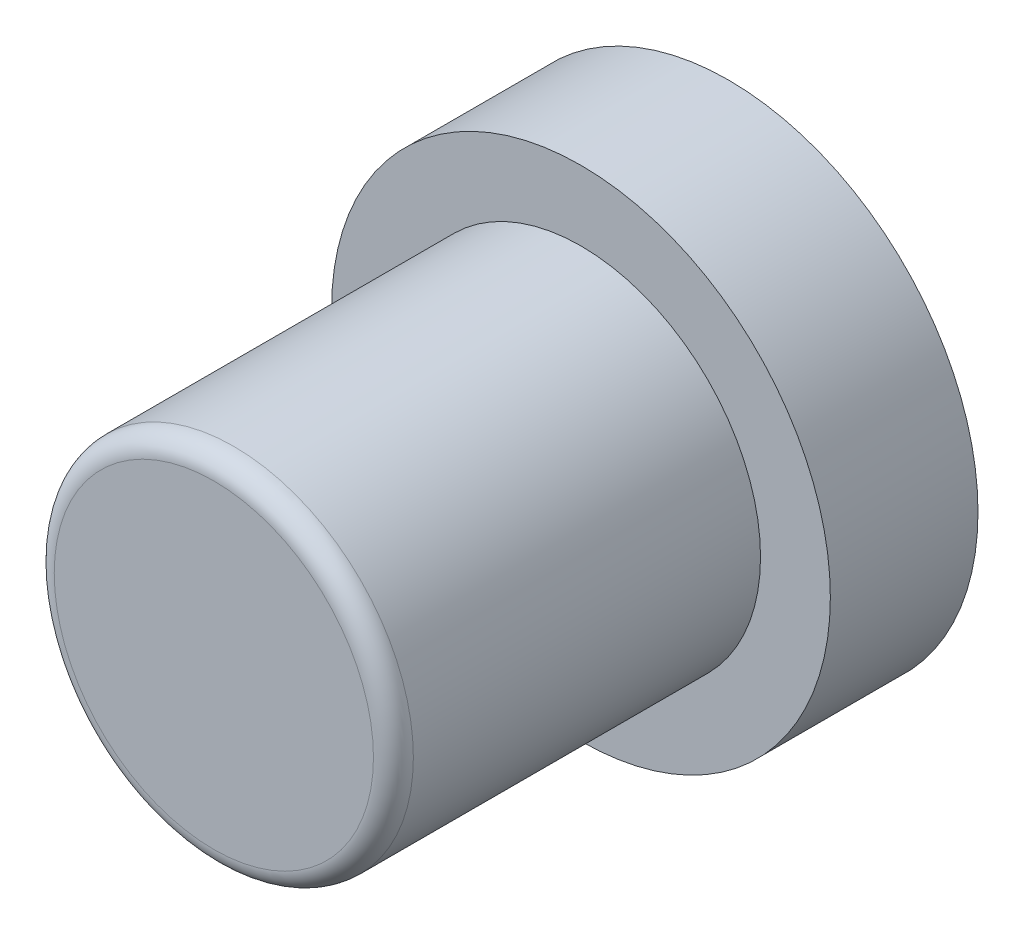
ISO-10303-21;
HEADER;
FILE_DESCRIPTION(('STEP AP214'),'2;1');
FILE_NAME('part.step','',(''),(''),'','','');
FILE_SCHEMA(('AUTOMOTIVE_DESIGN { 1 0 10303 214 1 1 1 1 }'));
ENDSEC;
DATA;
#1=APPLICATION_CONTEXT('core data for automotive mechanical design processes');
#2=APPLICATION_PROTOCOL_DEFINITION('international standard','automotive_design',2000,#1);
#3=PRODUCT_CONTEXT('',#1,'mechanical');
#4=PRODUCT('Part','Part','',(#3));
#5=PRODUCT_RELATED_PRODUCT_CATEGORY('part','',(#4));
#6=PRODUCT_DEFINITION_FORMATION('','',#4);
#7=PRODUCT_DEFINITION_CONTEXT('part definition',#1,'design');
#8=PRODUCT_DEFINITION('design','',#6,#7);
#9=PRODUCT_DEFINITION_SHAPE('','',#8);
#10=(LENGTH_UNIT() NAMED_UNIT(*) SI_UNIT(.MILLI.,.METRE.));
#11=(NAMED_UNIT(*) PLANE_ANGLE_UNIT() SI_UNIT($,.RADIAN.));
#12=(NAMED_UNIT(*) SI_UNIT($,.STERADIAN.) SOLID_ANGLE_UNIT());
#13=UNCERTAINTY_MEASURE_WITH_UNIT(LENGTH_MEASURE(1.E-05),#10,'distance_accuracy_value','');
#14=(GEOMETRIC_REPRESENTATION_CONTEXT(3) GLOBAL_UNCERTAINTY_ASSIGNED_CONTEXT((#13)) GLOBAL_UNIT_ASSIGNED_CONTEXT((#10,
#11,#12)) REPRESENTATION_CONTEXT('',''));
#15=CARTESIAN_POINT('',(0.,0.,0.));
#16=DIRECTION('',(0.,0.,1.));
#17=DIRECTION('',(1.,0.,0.));
#18=AXIS2_PLACEMENT_3D('',#15,#16,#17);
#19=CARTESIAN_POINT('',(0.,0.,3.7));
#20=DIRECTION('',(0.,0.,-1.));
#21=DIRECTION('',(-1.,0.,0.));
#22=AXIS2_PLACEMENT_3D('',#19,#20,#21);
#23=CYLINDRICAL_SURFACE('',#22,6.25);
#24=CARTESIAN_POINT('',(0.,0.,3.7));
#25=DIRECTION('',(0.,0.,1.));
#26=DIRECTION('',(1.,0.,0.));
#27=AXIS2_PLACEMENT_3D('',#24,#25,#26);
#28=CIRCLE('',#27,6.25);
#29=CARTESIAN_POINT('',(6.25,0.,3.7));
#30=VERTEX_POINT('',#29);
#31=EDGE_CURVE('E45',#30,#30,#28,.T.);
#32=ORIENTED_EDGE('',*,*,#31,.F.);
#33=EDGE_LOOP('',(#32));
#34=FACE_BOUND('',#33,.T.);
#35=CARTESIAN_POINT('',(0.,0.,0.));
#36=DIRECTION('',(0.,0.,1.));
#37=DIRECTION('',(1.,0.,0.));
#38=AXIS2_PLACEMENT_3D('',#35,#36,#37);
#39=CIRCLE('',#38,6.25);
#40=CARTESIAN_POINT('',(6.25,0.,0.));
#41=VERTEX_POINT('',#40);
#42=EDGE_CURVE('E48',#41,#41,#39,.T.);
#43=ORIENTED_EDGE('',*,*,#42,.T.);
#44=EDGE_LOOP('',(#43));
#45=FACE_BOUND('',#44,.T.);
#46=ADVANCED_FACE('F30',(#34,#45),#23,.T.);
#47=CARTESIAN_POINT('',(0.,0.,3.7));
#48=DIRECTION('',(0.,0.,1.));
#49=DIRECTION('',(1.,0.,0.));
#50=AXIS2_PLACEMENT_3D('',#47,#48,#49);
#51=PLANE('',#50);
#52=CARTESIAN_POINT('',(0.,0.,3.7));
#53=DIRECTION('',(0.,0.,1.));
#54=DIRECTION('',(1.,0.,0.));
#55=AXIS2_PLACEMENT_3D('',#52,#53,#54);
#56=CIRCLE('',#55,4.5);
#57=CARTESIAN_POINT('',(4.5,0.,3.7));
#58=VERTEX_POINT('',#57);
#59=EDGE_CURVE('E41',#58,#58,#56,.T.);
#60=ORIENTED_EDGE('',*,*,#59,.F.);
#61=EDGE_LOOP('',(#60));
#62=FACE_BOUND('',#61,.T.);
#63=ORIENTED_EDGE('',*,*,#31,.T.);
#64=EDGE_LOOP('',(#63));
#65=FACE_BOUND('',#64,.T.);
#66=ADVANCED_FACE('F54',(#62,#65),#51,.T.);
#67=CARTESIAN_POINT('',(0.,0.,0.));
#68=DIRECTION('',(0.,0.,1.));
#69=DIRECTION('',(1.,0.,0.));
#70=AXIS2_PLACEMENT_3D('',#67,#68,#69);
#71=PLANE('',#70);
#72=ORIENTED_EDGE('',*,*,#42,.F.);
#73=EDGE_LOOP('',(#72));
#74=FACE_BOUND('',#73,.T.);
#75=ADVANCED_FACE('F60',(#74),#71,.F.);
#76=CARTESIAN_POINT('',(0.,0.,12.9));
#77=DIRECTION('',(0.,0.,-1.));
#78=DIRECTION('',(-1.,0.,0.));
#79=AXIS2_PLACEMENT_3D('',#76,#77,#78);
#80=CYLINDRICAL_SURFACE('',#79,4.5);
#81=CARTESIAN_POINT('',(0.,0.,12.4));
#82=DIRECTION('',(0.,0.,1.));
#83=DIRECTION('',(1.,0.,0.));
#84=AXIS2_PLACEMENT_3D('',#81,#82,#83);
#85=CIRCLE('',#84,4.5);
#86=CARTESIAN_POINT('',(4.5,0.,12.4));
#87=VERTEX_POINT('',#86);
#88=EDGE_CURVE('E10',#87,#87,#85,.F.);
#89=ORIENTED_EDGE('',*,*,#88,.T.);
#90=EDGE_LOOP('',(#89));
#91=FACE_BOUND('',#90,.T.);
#92=ORIENTED_EDGE('',*,*,#59,.T.);
#93=EDGE_LOOP('',(#92));
#94=FACE_BOUND('',#93,.T.);
#95=ADVANCED_FACE('F62',(#91,#94),#80,.T.);
#96=CARTESIAN_POINT('',(0.,0.,12.9));
#97=DIRECTION('',(0.,0.,1.));
#98=DIRECTION('',(1.,0.,0.));
#99=AXIS2_PLACEMENT_3D('',#96,#97,#98);
#100=PLANE('',#99);
#101=CARTESIAN_POINT('',(0.,0.,12.9));
#102=DIRECTION('',(0.,0.,1.));
#103=DIRECTION('',(1.,0.,0.));
#104=AXIS2_PLACEMENT_3D('',#101,#102,#103);
#105=CIRCLE('',#104,4.);
#106=CARTESIAN_POINT('',(4.,0.,12.9));
#107=VERTEX_POINT('',#106);
#108=EDGE_CURVE('E37',#107,#107,#105,.T.);
#109=ORIENTED_EDGE('',*,*,#108,.T.);
#110=EDGE_LOOP('',(#109));
#111=FACE_BOUND('',#110,.T.);
#112=ADVANCED_FACE('F68',(#111),#100,.T.);
#113=CARTESIAN_POINT('',(0.,0.,12.4));
#114=DIRECTION('',(0.,0.,1.));
#115=DIRECTION('',(1.,0.,0.));
#116=AXIS2_PLACEMENT_3D('',#113,#114,#115);
#117=TOROIDAL_SURFACE('',#116,4.,0.5);
#118=ORIENTED_EDGE('',*,*,#88,.F.);
#119=EDGE_LOOP('',(#118));
#120=FACE_BOUND('',#119,.T.);
#121=ORIENTED_EDGE('',*,*,#108,.F.);
#122=EDGE_LOOP('',(#121));
#123=FACE_BOUND('',#122,.T.);
#124=ADVANCED_FACE('F32',(#120,#123),#117,.T.);
#125=CLOSED_SHELL('',(#46,#66,#75,#95,#112,#124));
#126=MANIFOLD_SOLID_BREP('B2',#125);
#127=ADVANCED_BREP_SHAPE_REPRESENTATION('',(#18,#126),#14);
#128=SHAPE_DEFINITION_REPRESENTATION(#9,#127);
ENDSEC;
END-ISO-10303-21;
